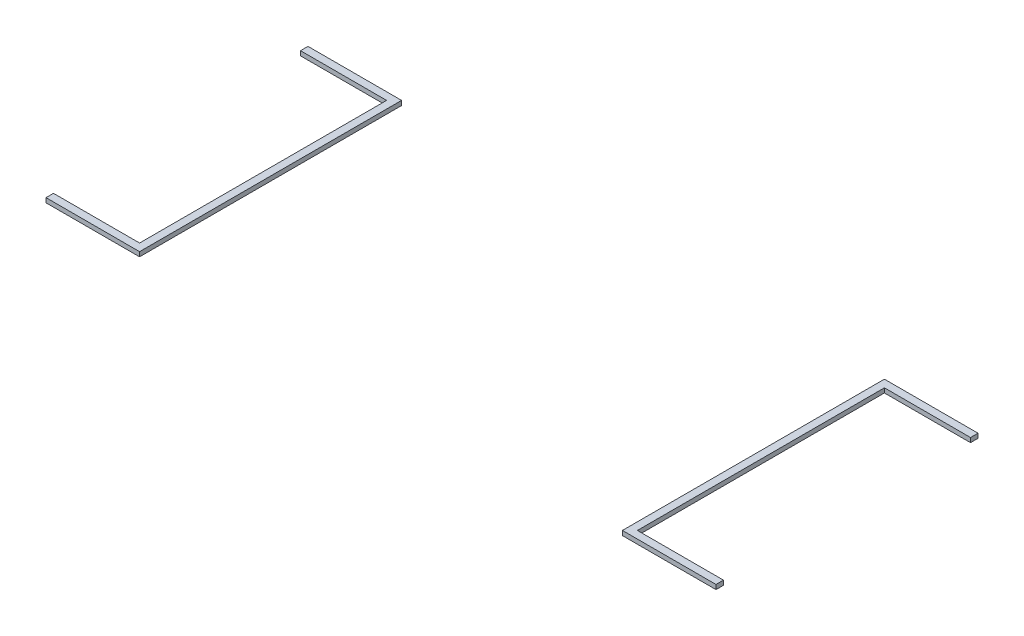
ISO-10303-21;
HEADER;
FILE_DESCRIPTION(('STEP AP214'),'2;1');
FILE_NAME('part.step','',(''),(''),'','','');
FILE_SCHEMA(('AUTOMOTIVE_DESIGN { 1 0 10303 214 1 1 1 1 }'));
ENDSEC;
DATA;
#1=APPLICATION_CONTEXT('core data for automotive mechanical design processes');
#2=APPLICATION_PROTOCOL_DEFINITION('international standard','automotive_design',2000,#1);
#3=PRODUCT_CONTEXT('',#1,'mechanical');
#4=PRODUCT('Part','Part','',(#3));
#5=PRODUCT_RELATED_PRODUCT_CATEGORY('part','',(#4));
#6=PRODUCT_DEFINITION_FORMATION('','',#4);
#7=PRODUCT_DEFINITION_CONTEXT('part definition',#1,'design');
#8=PRODUCT_DEFINITION('design','',#6,#7);
#9=PRODUCT_DEFINITION_SHAPE('','',#8);
#10=(LENGTH_UNIT() NAMED_UNIT(*) SI_UNIT(.MILLI.,.METRE.));
#11=(NAMED_UNIT(*) PLANE_ANGLE_UNIT() SI_UNIT($,.RADIAN.));
#12=(NAMED_UNIT(*) SI_UNIT($,.STERADIAN.) SOLID_ANGLE_UNIT());
#13=UNCERTAINTY_MEASURE_WITH_UNIT(LENGTH_MEASURE(1.E-05),#10,'distance_accuracy_value','');
#14=(GEOMETRIC_REPRESENTATION_CONTEXT(3) GLOBAL_UNCERTAINTY_ASSIGNED_CONTEXT((#13)) GLOBAL_UNIT_ASSIGNED_CONTEXT((#10,
#11,#12)) REPRESENTATION_CONTEXT('',''));
#15=CARTESIAN_POINT('',(0.,0.,0.));
#16=DIRECTION('',(0.,0.,1.));
#17=DIRECTION('',(1.,0.,0.));
#18=AXIS2_PLACEMENT_3D('',#15,#16,#17);
#19=CARTESIAN_POINT('',(-645.,12.,0.));
#20=DIRECTION('',(-1.,0.,0.));
#21=DIRECTION('',(0.,0.,1.));
#22=AXIS2_PLACEMENT_3D('',#19,#20,#21);
#23=PLANE('',#22);
#24=DIRECTION('',(0.,0.,-1.));
#25=VECTOR('',#24,1.);
#26=CARTESIAN_POINT('',(-645.,0.,0.));
#27=LINE('',#26,#25);
#28=CARTESIAN_POINT('',(-645.,0.,350.));
#29=VERTEX_POINT('',#28);
#30=CARTESIAN_POINT('',(-645.,0.,-350.));
#31=VERTEX_POINT('',#30);
#32=EDGE_CURVE('E150',#29,#31,#27,.T.);
#33=ORIENTED_EDGE('',*,*,#32,.T.);
#34=DIRECTION('',(0.,-1.,0.));
#35=VECTOR('',#34,1.);
#36=CARTESIAN_POINT('',(-645.,12.,-350.));
#37=LINE('',#36,#35);
#38=CARTESIAN_POINT('',(-645.,12.,-350.));
#39=VERTEX_POINT('',#38);
#40=EDGE_CURVE('E12',#39,#31,#37,.T.);
#41=ORIENTED_EDGE('',*,*,#40,.F.);
#42=DIRECTION('',(0.,0.,-1.));
#43=VECTOR('',#42,1.);
#44=CARTESIAN_POINT('',(-645.,12.,0.));
#45=LINE('',#44,#43);
#46=CARTESIAN_POINT('',(-645.,12.,350.));
#47=VERTEX_POINT('',#46);
#48=EDGE_CURVE('E172',#47,#39,#45,.T.);
#49=ORIENTED_EDGE('',*,*,#48,.F.);
#50=DIRECTION('',(0.,-1.,0.));
#51=VECTOR('',#50,1.);
#52=CARTESIAN_POINT('',(-645.,12.,350.));
#53=LINE('',#52,#51);
#54=EDGE_CURVE('E146',#47,#29,#53,.T.);
#55=ORIENTED_EDGE('',*,*,#54,.T.);
#56=EDGE_LOOP('',(#33,#41,#49,#55));
#57=FACE_BOUND('',#56,.T.);
#58=ADVANCED_FACE('F49',(#57),#23,.F.);
#59=CARTESIAN_POINT('',(0.,12.,-350.));
#60=DIRECTION('',(0.,0.,1.));
#61=DIRECTION('',(1.,0.,0.));
#62=AXIS2_PLACEMENT_3D('',#59,#60,#61);
#63=PLANE('',#62);
#64=DIRECTION('',(-1.,0.,0.));
#65=VECTOR('',#64,1.);
#66=CARTESIAN_POINT('',(0.,0.,-350.));
#67=LINE('',#66,#65);
#68=CARTESIAN_POINT('',(-895.,0.,-350.));
#69=VERTEX_POINT('',#68);
#70=EDGE_CURVE('E154',#31,#69,#67,.T.);
#71=ORIENTED_EDGE('',*,*,#70,.T.);
#72=DIRECTION('',(0.,-1.,0.));
#73=VECTOR('',#72,1.);
#74=CARTESIAN_POINT('',(-895.,12.,-350.));
#75=LINE('',#74,#73);
#76=CARTESIAN_POINT('',(-895.,12.,-350.));
#77=VERTEX_POINT('',#76);
#78=EDGE_CURVE('E58',#77,#69,#75,.T.);
#79=ORIENTED_EDGE('',*,*,#78,.F.);
#80=DIRECTION('',(-1.,0.,0.));
#81=VECTOR('',#80,1.);
#82=CARTESIAN_POINT('',(0.,12.,-350.));
#83=LINE('',#82,#81);
#84=EDGE_CURVE('E109',#39,#77,#83,.T.);
#85=ORIENTED_EDGE('',*,*,#84,.F.);
#86=ORIENTED_EDGE('',*,*,#40,.T.);
#87=EDGE_LOOP('',(#71,#79,#85,#86));
#88=FACE_BOUND('',#87,.T.);
#89=ADVANCED_FACE('F218',(#88),#63,.F.);
#90=CARTESIAN_POINT('',(-895.,12.,0.));
#91=DIRECTION('',(1.,0.,0.));
#92=DIRECTION('',(0.,0.,-1.));
#93=AXIS2_PLACEMENT_3D('',#90,#91,#92);
#94=PLANE('',#93);
#95=DIRECTION('',(0.,0.,1.));
#96=VECTOR('',#95,1.);
#97=CARTESIAN_POINT('',(-895.,0.,0.));
#98=LINE('',#97,#96);
#99=CARTESIAN_POINT('',(-895.,0.,-330.));
#100=VERTEX_POINT('',#99);
#101=EDGE_CURVE('E157',#69,#100,#98,.T.);
#102=ORIENTED_EDGE('',*,*,#101,.T.);
#103=DIRECTION('',(0.,-1.,0.));
#104=VECTOR('',#103,1.);
#105=CARTESIAN_POINT('',(-895.,12.,-330.));
#106=LINE('',#105,#104);
#107=CARTESIAN_POINT('',(-895.,12.,-330.));
#108=VERTEX_POINT('',#107);
#109=EDGE_CURVE('E183',#108,#100,#106,.T.);
#110=ORIENTED_EDGE('',*,*,#109,.F.);
#111=DIRECTION('',(0.,0.,1.));
#112=VECTOR('',#111,1.);
#113=CARTESIAN_POINT('',(-895.,12.,0.));
#114=LINE('',#113,#112);
#115=EDGE_CURVE('E193',#77,#108,#114,.T.);
#116=ORIENTED_EDGE('',*,*,#115,.F.);
#117=ORIENTED_EDGE('',*,*,#78,.T.);
#118=EDGE_LOOP('',(#102,#110,#116,#117));
#119=FACE_BOUND('',#118,.T.);
#120=ADVANCED_FACE('F191',(#119),#94,.F.);
#121=CARTESIAN_POINT('',(0.,12.,-330.));
#122=DIRECTION('',(0.,0.,-1.));
#123=DIRECTION('',(-1.,0.,0.));
#124=AXIS2_PLACEMENT_3D('',#121,#122,#123);
#125=PLANE('',#124);
#126=DIRECTION('',(1.,0.,0.));
#127=VECTOR('',#126,1.);
#128=CARTESIAN_POINT('',(0.,0.,-330.));
#129=LINE('',#128,#127);
#130=CARTESIAN_POINT('',(-665.,0.,-330.));
#131=VERTEX_POINT('',#130);
#132=EDGE_CURVE('E160',#100,#131,#129,.T.);
#133=ORIENTED_EDGE('',*,*,#132,.T.);
#134=DIRECTION('',(0.,-1.,0.));
#135=VECTOR('',#134,1.);
#136=CARTESIAN_POINT('',(-665.,12.,-330.));
#137=LINE('',#136,#135);
#138=CARTESIAN_POINT('',(-665.,12.,-330.));
#139=VERTEX_POINT('',#138);
#140=EDGE_CURVE('E179',#139,#131,#137,.T.);
#141=ORIENTED_EDGE('',*,*,#140,.F.);
#142=DIRECTION('',(1.,0.,0.));
#143=VECTOR('',#142,1.);
#144=CARTESIAN_POINT('',(0.,12.,-330.));
#145=LINE('',#144,#143);
#146=EDGE_CURVE('E206',#108,#139,#145,.T.);
#147=ORIENTED_EDGE('',*,*,#146,.F.);
#148=ORIENTED_EDGE('',*,*,#109,.T.);
#149=EDGE_LOOP('',(#133,#141,#147,#148));
#150=FACE_BOUND('',#149,.T.);
#151=ADVANCED_FACE('F201',(#150),#125,.F.);
#152=CARTESIAN_POINT('',(-665.,12.,0.));
#153=DIRECTION('',(1.,0.,0.));
#154=DIRECTION('',(0.,0.,-1.));
#155=AXIS2_PLACEMENT_3D('',#152,#153,#154);
#156=PLANE('',#155);
#157=DIRECTION('',(0.,0.,1.));
#158=VECTOR('',#157,1.);
#159=CARTESIAN_POINT('',(-665.,0.,0.));
#160=LINE('',#159,#158);
#161=CARTESIAN_POINT('',(-665.,0.,330.));
#162=VERTEX_POINT('',#161);
#163=EDGE_CURVE('E163',#131,#162,#160,.T.);
#164=ORIENTED_EDGE('',*,*,#163,.T.);
#165=DIRECTION('',(0.,-1.,0.));
#166=VECTOR('',#165,1.);
#167=CARTESIAN_POINT('',(-665.,12.,330.));
#168=LINE('',#167,#166);
#169=CARTESIAN_POINT('',(-665.,12.,330.));
#170=VERTEX_POINT('',#169);
#171=EDGE_CURVE('E139',#170,#162,#168,.T.);
#172=ORIENTED_EDGE('',*,*,#171,.F.);
#173=DIRECTION('',(0.,0.,1.));
#174=VECTOR('',#173,1.);
#175=CARTESIAN_POINT('',(-665.,12.,0.));
#176=LINE('',#175,#174);
#177=EDGE_CURVE('E128',#139,#170,#176,.T.);
#178=ORIENTED_EDGE('',*,*,#177,.F.);
#179=ORIENTED_EDGE('',*,*,#140,.T.);
#180=EDGE_LOOP('',(#164,#172,#178,#179));
#181=FACE_BOUND('',#180,.T.);
#182=ADVANCED_FACE('F204',(#181),#156,.F.);
#183=CARTESIAN_POINT('',(0.,12.,330.));
#184=DIRECTION('',(0.,0.,1.));
#185=DIRECTION('',(1.,0.,0.));
#186=AXIS2_PLACEMENT_3D('',#183,#184,#185);
#187=PLANE('',#186);
#188=DIRECTION('',(-1.,0.,0.));
#189=VECTOR('',#188,1.);
#190=CARTESIAN_POINT('',(0.,0.,330.));
#191=LINE('',#190,#189);
#192=CARTESIAN_POINT('',(-895.,0.,330.));
#193=VERTEX_POINT('',#192);
#194=EDGE_CURVE('E137',#162,#193,#191,.T.);
#195=ORIENTED_EDGE('',*,*,#194,.T.);
#196=DIRECTION('',(0.,-1.,0.));
#197=VECTOR('',#196,1.);
#198=CARTESIAN_POINT('',(-895.,12.,330.));
#199=LINE('',#198,#197);
#200=CARTESIAN_POINT('',(-895.,12.,330.));
#201=VERTEX_POINT('',#200);
#202=EDGE_CURVE('E134',#201,#193,#199,.T.);
#203=ORIENTED_EDGE('',*,*,#202,.F.);
#204=DIRECTION('',(-1.,0.,0.));
#205=VECTOR('',#204,1.);
#206=CARTESIAN_POINT('',(0.,12.,330.));
#207=LINE('',#206,#205);
#208=EDGE_CURVE('E122',#170,#201,#207,.T.);
#209=ORIENTED_EDGE('',*,*,#208,.F.);
#210=ORIENTED_EDGE('',*,*,#171,.T.);
#211=EDGE_LOOP('',(#195,#203,#209,#210));
#212=FACE_BOUND('',#211,.T.);
#213=ADVANCED_FACE('F135',(#212),#187,.F.);
#214=CARTESIAN_POINT('',(-895.,12.,0.));
#215=DIRECTION('',(1.,0.,0.));
#216=DIRECTION('',(0.,0.,-1.));
#217=AXIS2_PLACEMENT_3D('',#214,#215,#216);
#218=PLANE('',#217);
#219=DIRECTION('',(0.,0.,1.));
#220=VECTOR('',#219,1.);
#221=CARTESIAN_POINT('',(-895.,0.,0.));
#222=LINE('',#221,#220);
#223=CARTESIAN_POINT('',(-895.,0.,350.));
#224=VERTEX_POINT('',#223);
#225=EDGE_CURVE('E95',#193,#224,#222,.T.);
#226=ORIENTED_EDGE('',*,*,#225,.T.);
#227=DIRECTION('',(0.,-1.,0.));
#228=VECTOR('',#227,1.);
#229=CARTESIAN_POINT('',(-895.,12.,350.));
#230=LINE('',#229,#228);
#231=CARTESIAN_POINT('',(-895.,12.,350.));
#232=VERTEX_POINT('',#231);
#233=EDGE_CURVE('E140',#232,#224,#230,.T.);
#234=ORIENTED_EDGE('',*,*,#233,.F.);
#235=DIRECTION('',(0.,0.,1.));
#236=VECTOR('',#235,1.);
#237=CARTESIAN_POINT('',(-895.,12.,0.));
#238=LINE('',#237,#236);
#239=EDGE_CURVE('E126',#201,#232,#238,.T.);
#240=ORIENTED_EDGE('',*,*,#239,.F.);
#241=ORIENTED_EDGE('',*,*,#202,.T.);
#242=EDGE_LOOP('',(#226,#234,#240,#241));
#243=FACE_BOUND('',#242,.T.);
#244=ADVANCED_FACE('F142',(#243),#218,.F.);
#245=CARTESIAN_POINT('',(0.,12.,350.));
#246=DIRECTION('',(0.,0.,-1.));
#247=DIRECTION('',(-1.,0.,0.));
#248=AXIS2_PLACEMENT_3D('',#245,#246,#247);
#249=PLANE('',#248);
#250=DIRECTION('',(1.,0.,0.));
#251=VECTOR('',#250,1.);
#252=CARTESIAN_POINT('',(0.,0.,350.));
#253=LINE('',#252,#251);
#254=EDGE_CURVE('E101',#224,#29,#253,.T.);
#255=ORIENTED_EDGE('',*,*,#254,.T.);
#256=ORIENTED_EDGE('',*,*,#54,.F.);
#257=DIRECTION('',(1.,0.,0.));
#258=VECTOR('',#257,1.);
#259=CARTESIAN_POINT('',(0.,12.,350.));
#260=LINE('',#259,#258);
#261=EDGE_CURVE('E66',#232,#47,#260,.T.);
#262=ORIENTED_EDGE('',*,*,#261,.F.);
#263=ORIENTED_EDGE('',*,*,#233,.T.);
#264=EDGE_LOOP('',(#255,#256,#262,#263));
#265=FACE_BOUND('',#264,.T.);
#266=ADVANCED_FACE('F234',(#265),#249,.F.);
#267=CARTESIAN_POINT('',(0.,12.,0.));
#268=DIRECTION('',(0.,1.,0.));
#269=DIRECTION('',(0.,0.,1.));
#270=AXIS2_PLACEMENT_3D('',#267,#268,#269);
#271=PLANE('',#270);
#272=ORIENTED_EDGE('',*,*,#48,.T.);
#273=ORIENTED_EDGE('',*,*,#84,.T.);
#274=ORIENTED_EDGE('',*,*,#115,.T.);
#275=ORIENTED_EDGE('',*,*,#146,.T.);
#276=ORIENTED_EDGE('',*,*,#177,.T.);
#277=ORIENTED_EDGE('',*,*,#208,.T.);
#278=ORIENTED_EDGE('',*,*,#239,.T.);
#279=ORIENTED_EDGE('',*,*,#261,.T.);
#280=EDGE_LOOP('',(#272,#273,#274,#275,#276,#277,#278,#279));
#281=FACE_BOUND('',#280,.T.);
#282=ADVANCED_FACE('F124',(#281),#271,.T.);
#283=CARTESIAN_POINT('',(0.,0.,0.));
#284=DIRECTION('',(0.,1.,0.));
#285=DIRECTION('',(0.,0.,1.));
#286=AXIS2_PLACEMENT_3D('',#283,#284,#285);
#287=PLANE('',#286);
#288=ORIENTED_EDGE('',*,*,#32,.F.);
#289=ORIENTED_EDGE('',*,*,#254,.F.);
#290=ORIENTED_EDGE('',*,*,#225,.F.);
#291=ORIENTED_EDGE('',*,*,#194,.F.);
#292=ORIENTED_EDGE('',*,*,#163,.F.);
#293=ORIENTED_EDGE('',*,*,#132,.F.);
#294=ORIENTED_EDGE('',*,*,#101,.F.);
#295=ORIENTED_EDGE('',*,*,#70,.F.);
#296=EDGE_LOOP('',(#288,#289,#290,#291,#292,#293,#294,#295));
#297=FACE_BOUND('',#296,.T.);
#298=ADVANCED_FACE('F197',(#297),#287,.F.);
#299=CLOSED_SHELL('',(#58,#89,#120,#151,#182,#213,#244,#266,#282,#298));
#300=MANIFOLD_SOLID_BREP('B2',#299);
#301=CARTESIAN_POINT('',(895.,12.,0.));
#302=DIRECTION('',(-1.,0.,0.));
#303=DIRECTION('',(0.,0.,1.));
#304=AXIS2_PLACEMENT_3D('',#301,#302,#303);
#305=PLANE('',#304);
#306=DIRECTION('',(0.,0.,-1.));
#307=VECTOR('',#306,1.);
#308=CARTESIAN_POINT('',(895.,0.,0.));
#309=LINE('',#308,#307);
#310=CARTESIAN_POINT('',(895.,0.,-330.));
#311=VERTEX_POINT('',#310);
#312=CARTESIAN_POINT('',(895.,0.,-350.));
#313=VERTEX_POINT('',#312);
#314=EDGE_CURVE('E397',#311,#313,#309,.T.);
#315=ORIENTED_EDGE('',*,*,#314,.T.);
#316=DIRECTION('',(0.,-1.,0.));
#317=VECTOR('',#316,1.);
#318=CARTESIAN_POINT('',(895.,12.,-350.));
#319=LINE('',#318,#317);
#320=CARTESIAN_POINT('',(895.,12.,-350.));
#321=VERTEX_POINT('',#320);
#322=EDGE_CURVE('E47',#321,#313,#319,.T.);
#323=ORIENTED_EDGE('',*,*,#322,.F.);
#324=DIRECTION('',(0.,0.,-1.));
#325=VECTOR('',#324,1.);
#326=CARTESIAN_POINT('',(895.,12.,0.));
#327=LINE('',#326,#325);
#328=CARTESIAN_POINT('',(895.,12.,-330.));
#329=VERTEX_POINT('',#328);
#330=EDGE_CURVE('E411',#329,#321,#327,.T.);
#331=ORIENTED_EDGE('',*,*,#330,.F.);
#332=DIRECTION('',(0.,-1.,0.));
#333=VECTOR('',#332,1.);
#334=CARTESIAN_POINT('',(895.,12.,-330.));
#335=LINE('',#334,#333);
#336=EDGE_CURVE('E393',#329,#311,#335,.T.);
#337=ORIENTED_EDGE('',*,*,#336,.T.);
#338=EDGE_LOOP('',(#315,#323,#331,#337));
#339=FACE_BOUND('',#338,.T.);
#340=ADVANCED_FACE('F301',(#339),#305,.F.);
#341=CARTESIAN_POINT('',(0.,12.,-350.));
#342=DIRECTION('',(0.,0.,1.));
#343=DIRECTION('',(1.,0.,0.));
#344=AXIS2_PLACEMENT_3D('',#341,#342,#343);
#345=PLANE('',#344);
#346=DIRECTION('',(-1.,0.,0.));
#347=VECTOR('',#346,1.);
#348=CARTESIAN_POINT('',(0.,0.,-350.));
#349=LINE('',#348,#347);
#350=CARTESIAN_POINT('',(645.,0.,-350.));
#351=VERTEX_POINT('',#350);
#352=EDGE_CURVE('E400',#313,#351,#349,.T.);
#353=ORIENTED_EDGE('',*,*,#352,.T.);
#354=DIRECTION('',(0.,-1.,0.));
#355=VECTOR('',#354,1.);
#356=CARTESIAN_POINT('',(645.,12.,-350.));
#357=LINE('',#356,#355);
#358=CARTESIAN_POINT('',(645.,12.,-350.));
#359=VERTEX_POINT('',#358);
#360=EDGE_CURVE('E309',#359,#351,#357,.T.);
#361=ORIENTED_EDGE('',*,*,#360,.F.);
#362=DIRECTION('',(-1.,0.,0.));
#363=VECTOR('',#362,1.);
#364=CARTESIAN_POINT('',(0.,12.,-350.));
#365=LINE('',#364,#363);
#366=EDGE_CURVE('E360',#321,#359,#365,.T.);
#367=ORIENTED_EDGE('',*,*,#366,.F.);
#368=ORIENTED_EDGE('',*,*,#322,.T.);
#369=EDGE_LOOP('',(#353,#361,#367,#368));
#370=FACE_BOUND('',#369,.T.);
#371=ADVANCED_FACE('F446',(#370),#345,.F.);
#372=CARTESIAN_POINT('',(645.,12.,0.));
#373=DIRECTION('',(1.,0.,0.));
#374=DIRECTION('',(0.,0.,-1.));
#375=AXIS2_PLACEMENT_3D('',#372,#373,#374);
#376=PLANE('',#375);
#377=DIRECTION('',(0.,0.,1.));
#378=VECTOR('',#377,1.);
#379=CARTESIAN_POINT('',(645.,0.,0.));
#380=LINE('',#379,#378);
#381=CARTESIAN_POINT('',(645.,0.,350.));
#382=VERTEX_POINT('',#381);
#383=EDGE_CURVE('E402',#351,#382,#380,.T.);
#384=ORIENTED_EDGE('',*,*,#383,.T.);
#385=DIRECTION('',(0.,-1.,0.));
#386=VECTOR('',#385,1.);
#387=CARTESIAN_POINT('',(645.,12.,350.));
#388=LINE('',#387,#386);
#389=CARTESIAN_POINT('',(645.,12.,350.));
#390=VERTEX_POINT('',#389);
#391=EDGE_CURVE('E418',#390,#382,#388,.T.);
#392=ORIENTED_EDGE('',*,*,#391,.F.);
#393=DIRECTION('',(0.,0.,1.));
#394=VECTOR('',#393,1.);
#395=CARTESIAN_POINT('',(645.,12.,0.));
#396=LINE('',#395,#394);
#397=EDGE_CURVE('E426',#359,#390,#396,.T.);
#398=ORIENTED_EDGE('',*,*,#397,.F.);
#399=ORIENTED_EDGE('',*,*,#360,.T.);
#400=EDGE_LOOP('',(#384,#392,#398,#399));
#401=FACE_BOUND('',#400,.T.);
#402=ADVANCED_FACE('F424',(#401),#376,.F.);
#403=CARTESIAN_POINT('',(0.,12.,350.));
#404=DIRECTION('',(0.,0.,-1.));
#405=DIRECTION('',(-1.,0.,0.));
#406=AXIS2_PLACEMENT_3D('',#403,#404,#405);
#407=PLANE('',#406);
#408=DIRECTION('',(1.,0.,0.));
#409=VECTOR('',#408,1.);
#410=CARTESIAN_POINT('',(0.,0.,350.));
#411=LINE('',#410,#409);
#412=CARTESIAN_POINT('',(895.,0.,350.));
#413=VERTEX_POINT('',#412);
#414=EDGE_CURVE('E404',#382,#413,#411,.T.);
#415=ORIENTED_EDGE('',*,*,#414,.T.);
#416=DIRECTION('',(0.,-1.,0.));
#417=VECTOR('',#416,1.);
#418=CARTESIAN_POINT('',(895.,12.,350.));
#419=LINE('',#418,#417);
#420=CARTESIAN_POINT('',(895.,12.,350.));
#421=VERTEX_POINT('',#420);
#422=EDGE_CURVE('E415',#421,#413,#419,.T.);
#423=ORIENTED_EDGE('',*,*,#422,.F.);
#424=DIRECTION('',(1.,0.,0.));
#425=VECTOR('',#424,1.);
#426=CARTESIAN_POINT('',(0.,12.,350.));
#427=LINE('',#426,#425);
#428=EDGE_CURVE('E438',#390,#421,#427,.T.);
#429=ORIENTED_EDGE('',*,*,#428,.F.);
#430=ORIENTED_EDGE('',*,*,#391,.T.);
#431=EDGE_LOOP('',(#415,#423,#429,#430));
#432=FACE_BOUND('',#431,.T.);
#433=ADVANCED_FACE('F434',(#432),#407,.F.);
#434=CARTESIAN_POINT('',(895.,12.,0.));
#435=DIRECTION('',(-1.,0.,0.));
#436=DIRECTION('',(0.,0.,1.));
#437=AXIS2_PLACEMENT_3D('',#434,#435,#436);
#438=PLANE('',#437);
#439=DIRECTION('',(0.,0.,-1.));
#440=VECTOR('',#439,1.);
#441=CARTESIAN_POINT('',(895.,0.,0.));
#442=LINE('',#441,#440);
#443=CARTESIAN_POINT('',(895.,0.,330.));
#444=VERTEX_POINT('',#443);
#445=EDGE_CURVE('E406',#413,#444,#442,.T.);
#446=ORIENTED_EDGE('',*,*,#445,.T.);
#447=DIRECTION('',(0.,-1.,0.));
#448=VECTOR('',#447,1.);
#449=CARTESIAN_POINT('',(895.,12.,330.));
#450=LINE('',#449,#448);
#451=CARTESIAN_POINT('',(895.,12.,330.));
#452=VERTEX_POINT('',#451);
#453=EDGE_CURVE('E388',#452,#444,#450,.T.);
#454=ORIENTED_EDGE('',*,*,#453,.F.);
#455=DIRECTION('',(0.,0.,-1.));
#456=VECTOR('',#455,1.);
#457=CARTESIAN_POINT('',(895.,12.,0.));
#458=LINE('',#457,#456);
#459=EDGE_CURVE('E379',#421,#452,#458,.T.);
#460=ORIENTED_EDGE('',*,*,#459,.F.);
#461=ORIENTED_EDGE('',*,*,#422,.T.);
#462=EDGE_LOOP('',(#446,#454,#460,#461));
#463=FACE_BOUND('',#462,.T.);
#464=ADVANCED_FACE('F437',(#463),#438,.F.);
#465=CARTESIAN_POINT('',(0.,12.,330.));
#466=DIRECTION('',(0.,0.,1.));
#467=DIRECTION('',(1.,0.,0.));
#468=AXIS2_PLACEMENT_3D('',#465,#466,#467);
#469=PLANE('',#468);
#470=DIRECTION('',(-1.,0.,0.));
#471=VECTOR('',#470,1.);
#472=CARTESIAN_POINT('',(0.,0.,330.));
#473=LINE('',#472,#471);
#474=CARTESIAN_POINT('',(665.,0.,330.));
#475=VERTEX_POINT('',#474);
#476=EDGE_CURVE('E387',#444,#475,#473,.T.);
#477=ORIENTED_EDGE('',*,*,#476,.T.);
#478=DIRECTION('',(0.,-1.,0.));
#479=VECTOR('',#478,1.);
#480=CARTESIAN_POINT('',(665.,12.,330.));
#481=LINE('',#480,#479);
#482=CARTESIAN_POINT('',(665.,12.,330.));
#483=VERTEX_POINT('',#482);
#484=EDGE_CURVE('E384',#483,#475,#481,.T.);
#485=ORIENTED_EDGE('',*,*,#484,.F.);
#486=DIRECTION('',(-1.,0.,0.));
#487=VECTOR('',#486,1.);
#488=CARTESIAN_POINT('',(0.,12.,330.));
#489=LINE('',#488,#487);
#490=EDGE_CURVE('E373',#452,#483,#489,.T.);
#491=ORIENTED_EDGE('',*,*,#490,.F.);
#492=ORIENTED_EDGE('',*,*,#453,.T.);
#493=EDGE_LOOP('',(#477,#485,#491,#492));
#494=FACE_BOUND('',#493,.T.);
#495=ADVANCED_FACE('F385',(#494),#469,.F.);
#496=CARTESIAN_POINT('',(665.,12.,0.));
#497=DIRECTION('',(-1.,0.,0.));
#498=DIRECTION('',(0.,0.,1.));
#499=AXIS2_PLACEMENT_3D('',#496,#497,#498);
#500=PLANE('',#499);
#501=DIRECTION('',(0.,0.,-1.));
#502=VECTOR('',#501,1.);
#503=CARTESIAN_POINT('',(665.,0.,0.));
#504=LINE('',#503,#502);
#505=CARTESIAN_POINT('',(665.,0.,-330.));
#506=VERTEX_POINT('',#505);
#507=EDGE_CURVE('E346',#475,#506,#504,.T.);
#508=ORIENTED_EDGE('',*,*,#507,.T.);
#509=DIRECTION('',(0.,-1.,0.));
#510=VECTOR('',#509,1.);
#511=CARTESIAN_POINT('',(665.,12.,-330.));
#512=LINE('',#511,#510);
#513=CARTESIAN_POINT('',(665.,12.,-330.));
#514=VERTEX_POINT('',#513);
#515=EDGE_CURVE('E389',#514,#506,#512,.T.);
#516=ORIENTED_EDGE('',*,*,#515,.F.);
#517=DIRECTION('',(0.,0.,-1.));
#518=VECTOR('',#517,1.);
#519=CARTESIAN_POINT('',(665.,12.,0.));
#520=LINE('',#519,#518);
#521=EDGE_CURVE('E377',#483,#514,#520,.T.);
#522=ORIENTED_EDGE('',*,*,#521,.F.);
#523=ORIENTED_EDGE('',*,*,#484,.T.);
#524=EDGE_LOOP('',(#508,#516,#522,#523));
#525=FACE_BOUND('',#524,.T.);
#526=ADVANCED_FACE('F391',(#525),#500,.F.);
#527=CARTESIAN_POINT('',(0.,12.,-330.));
#528=DIRECTION('',(0.,0.,-1.));
#529=DIRECTION('',(-1.,0.,0.));
#530=AXIS2_PLACEMENT_3D('',#527,#528,#529);
#531=PLANE('',#530);
#532=DIRECTION('',(1.,0.,0.));
#533=VECTOR('',#532,1.);
#534=CARTESIAN_POINT('',(0.,0.,-330.));
#535=LINE('',#534,#533);
#536=EDGE_CURVE('E352',#506,#311,#535,.T.);
#537=ORIENTED_EDGE('',*,*,#536,.T.);
#538=ORIENTED_EDGE('',*,*,#336,.F.);
#539=DIRECTION('',(1.,0.,0.));
#540=VECTOR('',#539,1.);
#541=CARTESIAN_POINT('',(0.,12.,-330.));
#542=LINE('',#541,#540);
#543=EDGE_CURVE('E317',#514,#329,#542,.T.);
#544=ORIENTED_EDGE('',*,*,#543,.F.);
#545=ORIENTED_EDGE('',*,*,#515,.T.);
#546=EDGE_LOOP('',(#537,#538,#544,#545));
#547=FACE_BOUND('',#546,.T.);
#548=ADVANCED_FACE('F462',(#547),#531,.F.);
#549=CARTESIAN_POINT('',(0.,12.,0.));
#550=DIRECTION('',(0.,1.,0.));
#551=DIRECTION('',(0.,0.,1.));
#552=AXIS2_PLACEMENT_3D('',#549,#550,#551);
#553=PLANE('',#552);
#554=ORIENTED_EDGE('',*,*,#330,.T.);
#555=ORIENTED_EDGE('',*,*,#366,.T.);
#556=ORIENTED_EDGE('',*,*,#397,.T.);
#557=ORIENTED_EDGE('',*,*,#428,.T.);
#558=ORIENTED_EDGE('',*,*,#459,.T.);
#559=ORIENTED_EDGE('',*,*,#490,.T.);
#560=ORIENTED_EDGE('',*,*,#521,.T.);
#561=ORIENTED_EDGE('',*,*,#543,.T.);
#562=EDGE_LOOP('',(#554,#555,#556,#557,#558,#559,#560,#561));
#563=FACE_BOUND('',#562,.T.);
#564=ADVANCED_FACE('F375',(#563),#553,.T.);
#565=CARTESIAN_POINT('',(0.,0.,0.));
#566=DIRECTION('',(0.,1.,0.));
#567=DIRECTION('',(0.,0.,1.));
#568=AXIS2_PLACEMENT_3D('',#565,#566,#567);
#569=PLANE('',#568);
#570=ORIENTED_EDGE('',*,*,#314,.F.);
#571=ORIENTED_EDGE('',*,*,#536,.F.);
#572=ORIENTED_EDGE('',*,*,#507,.F.);
#573=ORIENTED_EDGE('',*,*,#476,.F.);
#574=ORIENTED_EDGE('',*,*,#445,.F.);
#575=ORIENTED_EDGE('',*,*,#414,.F.);
#576=ORIENTED_EDGE('',*,*,#383,.F.);
#577=ORIENTED_EDGE('',*,*,#352,.F.);
#578=EDGE_LOOP('',(#570,#571,#572,#573,#574,#575,#576,#577));
#579=FACE_BOUND('',#578,.T.);
#580=ADVANCED_FACE('F430',(#579),#569,.F.);
#581=CLOSED_SHELL('',(#340,#371,#402,#433,#464,#495,#526,#548,#564,#580));
#582=MANIFOLD_SOLID_BREP('B6',#581);
#583=ADVANCED_BREP_SHAPE_REPRESENTATION('',(#18,#300,#582),#14);
#584=SHAPE_DEFINITION_REPRESENTATION(#9,#583);
ENDSEC;
END-ISO-10303-21;
